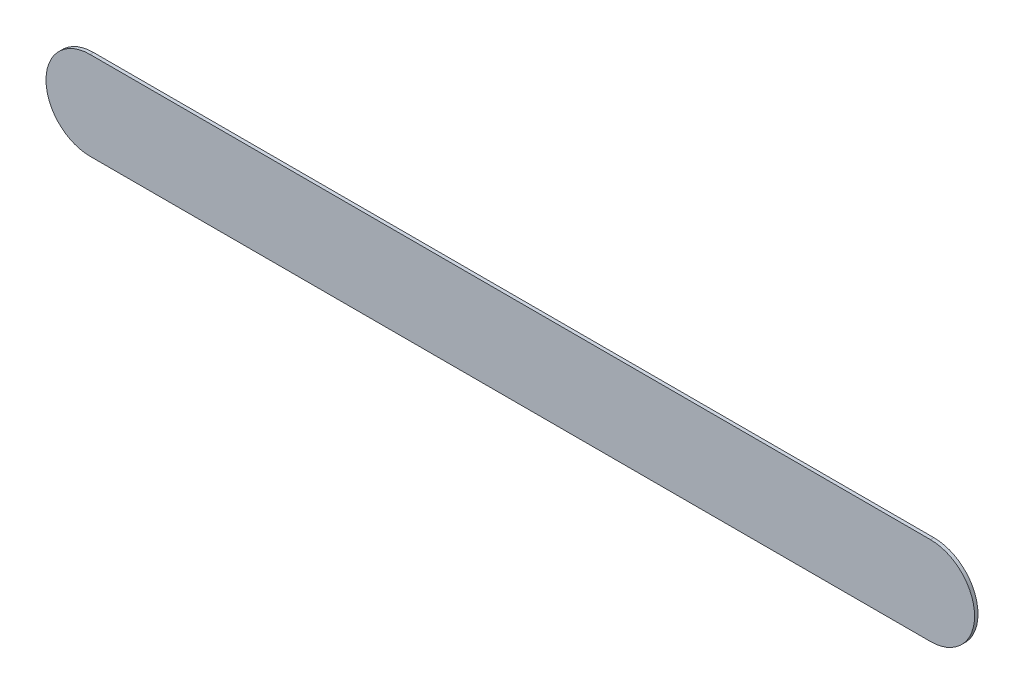
ISO-10303-21;
HEADER;
FILE_DESCRIPTION(('STEP AP214'),'2;1');
FILE_NAME('part.step','',(''),(''),'','','');
FILE_SCHEMA(('AUTOMOTIVE_DESIGN { 1 0 10303 214 1 1 1 1 }'));
ENDSEC;
DATA;
#1=APPLICATION_CONTEXT('core data for automotive mechanical design processes');
#2=APPLICATION_PROTOCOL_DEFINITION('international standard','automotive_design',2000,#1);
#3=PRODUCT_CONTEXT('',#1,'mechanical');
#4=PRODUCT('Part','Part','',(#3));
#5=PRODUCT_RELATED_PRODUCT_CATEGORY('part','',(#4));
#6=PRODUCT_DEFINITION_FORMATION('','',#4);
#7=PRODUCT_DEFINITION_CONTEXT('part definition',#1,'design');
#8=PRODUCT_DEFINITION('design','',#6,#7);
#9=PRODUCT_DEFINITION_SHAPE('','',#8);
#10=(LENGTH_UNIT() NAMED_UNIT(*) SI_UNIT(.MILLI.,.METRE.));
#11=(NAMED_UNIT(*) PLANE_ANGLE_UNIT() SI_UNIT($,.RADIAN.));
#12=(NAMED_UNIT(*) SI_UNIT($,.STERADIAN.) SOLID_ANGLE_UNIT());
#13=UNCERTAINTY_MEASURE_WITH_UNIT(LENGTH_MEASURE(1.E-05),#10,'distance_accuracy_value','');
#14=(GEOMETRIC_REPRESENTATION_CONTEXT(3) GLOBAL_UNCERTAINTY_ASSIGNED_CONTEXT((#13)) GLOBAL_UNIT_ASSIGNED_CONTEXT((#10,
#11,#12)) REPRESENTATION_CONTEXT('',''));
#15=CARTESIAN_POINT('',(0.,0.,0.));
#16=DIRECTION('',(0.,0.,1.));
#17=DIRECTION('',(1.,0.,0.));
#18=AXIS2_PLACEMENT_3D('',#15,#16,#17);
#19=CARTESIAN_POINT('',(160.23,-116.09,1.635));
#20=DIRECTION('',(0.,0.,1.));
#21=DIRECTION('',(1.,0.,0.));
#22=AXIS2_PLACEMENT_3D('',#19,#20,#21);
#23=PLANE('',#22);
#24=DIRECTION('',(-1.,0.,0.));
#25=VECTOR('',#24,1.);
#26=CARTESIAN_POINT('',(160.23,-116.09,1.635));
#27=LINE('',#26,#25);
#28=CARTESIAN_POINT('',(160.23,-116.09,1.635));
#29=VERTEX_POINT('',#28);
#30=CARTESIAN_POINT('',(151.66,-116.09,1.635));
#31=VERTEX_POINT('',#30);
#32=EDGE_CURVE('E81',#29,#31,#27,.T.);
#33=ORIENTED_EDGE('',*,*,#32,.T.);
#34=CARTESIAN_POINT('',(151.66,-116.54,1.635));
#35=DIRECTION('',(0.,0.,1.));
#36=DIRECTION('',(0.,1.,0.));
#37=AXIS2_PLACEMENT_3D('',#34,#35,#36);
#38=CIRCLE('',#37,0.45);
#39=CARTESIAN_POINT('',(151.66,-116.99,1.635));
#40=VERTEX_POINT('',#39);
#41=EDGE_CURVE('E106',#31,#40,#38,.T.);
#42=ORIENTED_EDGE('',*,*,#41,.T.);
#43=DIRECTION('',(1.,0.,0.));
#44=VECTOR('',#43,1.);
#45=CARTESIAN_POINT('',(151.66,-116.99,1.635));
#46=LINE('',#45,#44);
#47=CARTESIAN_POINT('',(160.23,-116.99,1.635));
#48=VERTEX_POINT('',#47);
#49=EDGE_CURVE('E74',#40,#48,#46,.T.);
#50=ORIENTED_EDGE('',*,*,#49,.T.);
#51=CARTESIAN_POINT('',(160.23,-116.54,1.635));
#52=DIRECTION('',(0.,0.,1.));
#53=DIRECTION('',(0.,-1.,0.));
#54=AXIS2_PLACEMENT_3D('',#51,#52,#53);
#55=CIRCLE('',#54,0.45);
#56=EDGE_CURVE('E11',#48,#29,#55,.T.);
#57=ORIENTED_EDGE('',*,*,#56,.T.);
#58=EDGE_LOOP('',(#33,#42,#50,#57));
#59=FACE_BOUND('',#58,.T.);
#60=ADVANCED_FACE('F17',(#59),#23,.T.);
#61=CARTESIAN_POINT('',(160.23,-116.09,1.6));
#62=DIRECTION('',(0.,0.,1.));
#63=DIRECTION('',(1.,0.,0.));
#64=AXIS2_PLACEMENT_3D('',#61,#62,#63);
#65=PLANE('',#64);
#66=CARTESIAN_POINT('',(160.23,-116.54,1.6));
#67=DIRECTION('',(0.,0.,1.));
#68=DIRECTION('',(0.,-1.,0.));
#69=AXIS2_PLACEMENT_3D('',#66,#67,#68);
#70=CIRCLE('',#69,0.45);
#71=CARTESIAN_POINT('',(160.23,-116.99,1.6));
#72=VERTEX_POINT('',#71);
#73=CARTESIAN_POINT('',(160.23,-116.09,1.6));
#74=VERTEX_POINT('',#73);
#75=EDGE_CURVE('E20',#72,#74,#70,.T.);
#76=ORIENTED_EDGE('',*,*,#75,.F.);
#77=DIRECTION('',(1.,0.,0.));
#78=VECTOR('',#77,1.);
#79=CARTESIAN_POINT('',(151.66,-116.99,1.6));
#80=LINE('',#79,#78);
#81=CARTESIAN_POINT('',(151.66,-116.99,1.6));
#82=VERTEX_POINT('',#81);
#83=EDGE_CURVE('E111',#82,#72,#80,.T.);
#84=ORIENTED_EDGE('',*,*,#83,.F.);
#85=CARTESIAN_POINT('',(151.66,-116.54,1.6));
#86=DIRECTION('',(0.,0.,1.));
#87=DIRECTION('',(0.,1.,0.));
#88=AXIS2_PLACEMENT_3D('',#85,#86,#87);
#89=CIRCLE('',#88,0.45);
#90=CARTESIAN_POINT('',(151.66,-116.09,1.6));
#91=VERTEX_POINT('',#90);
#92=EDGE_CURVE('E83',#91,#82,#89,.T.);
#93=ORIENTED_EDGE('',*,*,#92,.F.);
#94=DIRECTION('',(-1.,0.,0.));
#95=VECTOR('',#94,1.);
#96=CARTESIAN_POINT('',(160.23,-116.09,1.6));
#97=LINE('',#96,#95);
#98=EDGE_CURVE('E79',#74,#91,#97,.T.);
#99=ORIENTED_EDGE('',*,*,#98,.F.);
#100=EDGE_LOOP('',(#76,#84,#93,#99));
#101=FACE_BOUND('',#100,.T.);
#102=ADVANCED_FACE('F85',(#101),#65,.F.);
#103=CARTESIAN_POINT('',(160.23,-116.54,1.6));
#104=DIRECTION('',(0.,0.,-1.));
#105=DIRECTION('',(0.,-1.,0.));
#106=AXIS2_PLACEMENT_3D('',#103,#104,#105);
#107=CYLINDRICAL_SURFACE('',#106,0.45);
#108=ORIENTED_EDGE('',*,*,#75,.T.);
#109=DIRECTION('',(0.,0.,1.));
#110=VECTOR('',#109,1.);
#111=CARTESIAN_POINT('',(160.23,-116.09,1.6));
#112=LINE('',#111,#110);
#113=EDGE_CURVE('E68',#74,#29,#112,.T.);
#114=ORIENTED_EDGE('',*,*,#113,.T.);
#115=ORIENTED_EDGE('',*,*,#56,.F.);
#116=DIRECTION('',(0.,0.,1.));
#117=VECTOR('',#116,1.);
#118=CARTESIAN_POINT('',(160.23,-116.99,1.6));
#119=LINE('',#118,#117);
#120=EDGE_CURVE('E71',#72,#48,#119,.T.);
#121=ORIENTED_EDGE('',*,*,#120,.F.);
#122=EDGE_LOOP('',(#108,#114,#115,#121));
#123=FACE_BOUND('',#122,.T.);
#124=ADVANCED_FACE('F67',(#123),#107,.T.);
#125=CARTESIAN_POINT('',(151.66,-116.99,1.6));
#126=DIRECTION('',(0.,1.,0.));
#127=DIRECTION('',(1.,0.,0.));
#128=AXIS2_PLACEMENT_3D('',#125,#126,#127);
#129=PLANE('',#128);
#130=ORIENTED_EDGE('',*,*,#83,.T.);
#131=ORIENTED_EDGE('',*,*,#120,.T.);
#132=ORIENTED_EDGE('',*,*,#49,.F.);
#133=DIRECTION('',(0.,0.,1.));
#134=VECTOR('',#133,1.);
#135=CARTESIAN_POINT('',(151.66,-116.99,1.6));
#136=LINE('',#135,#134);
#137=EDGE_CURVE('E103',#82,#40,#136,.T.);
#138=ORIENTED_EDGE('',*,*,#137,.F.);
#139=EDGE_LOOP('',(#130,#131,#132,#138));
#140=FACE_BOUND('',#139,.T.);
#141=ADVANCED_FACE('F117',(#140),#129,.F.);
#142=CARTESIAN_POINT('',(151.66,-116.54,1.6));
#143=DIRECTION('',(0.,0.,-1.));
#144=DIRECTION('',(0.,1.,0.));
#145=AXIS2_PLACEMENT_3D('',#142,#143,#144);
#146=CYLINDRICAL_SURFACE('',#145,0.45);
#147=ORIENTED_EDGE('',*,*,#92,.T.);
#148=ORIENTED_EDGE('',*,*,#137,.T.);
#149=ORIENTED_EDGE('',*,*,#41,.F.);
#150=DIRECTION('',(0.,0.,1.));
#151=VECTOR('',#150,1.);
#152=CARTESIAN_POINT('',(151.66,-116.09,1.6));
#153=LINE('',#152,#151);
#154=EDGE_CURVE('E89',#91,#31,#153,.T.);
#155=ORIENTED_EDGE('',*,*,#154,.F.);
#156=EDGE_LOOP('',(#147,#148,#149,#155));
#157=FACE_BOUND('',#156,.T.);
#158=ADVANCED_FACE('F120',(#157),#146,.T.);
#159=CARTESIAN_POINT('',(160.23,-116.09,1.6));
#160=DIRECTION('',(0.,-1.,0.));
#161=DIRECTION('',(0.,0.,-1.));
#162=AXIS2_PLACEMENT_3D('',#159,#160,#161);
#163=PLANE('',#162);
#164=ORIENTED_EDGE('',*,*,#98,.T.);
#165=ORIENTED_EDGE('',*,*,#154,.T.);
#166=ORIENTED_EDGE('',*,*,#32,.F.);
#167=ORIENTED_EDGE('',*,*,#113,.F.);
#168=EDGE_LOOP('',(#164,#165,#166,#167));
#169=FACE_BOUND('',#168,.T.);
#170=ADVANCED_FACE('F77',(#169),#163,.F.);
#171=CLOSED_SHELL('',(#60,#102,#124,#141,#158,#170));
#172=MANIFOLD_SOLID_BREP('B1',#171);
#173=ADVANCED_BREP_SHAPE_REPRESENTATION('',(#18,#172),#14);
#174=SHAPE_DEFINITION_REPRESENTATION(#9,#173);
ENDSEC;
END-ISO-10303-21;
